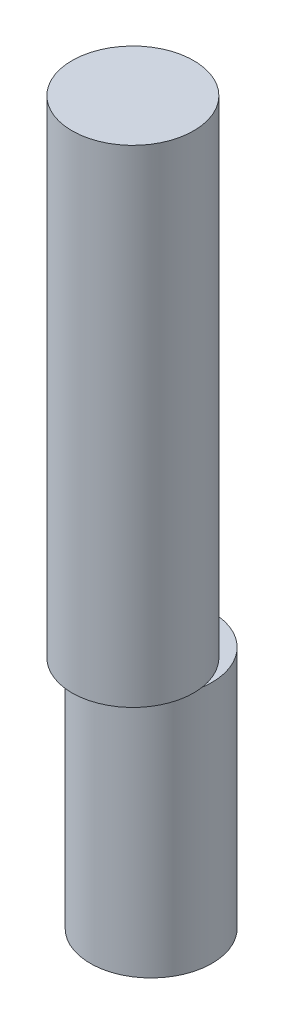
ISO-10303-21;
HEADER;
FILE_DESCRIPTION(('STEP AP214'),'2;1');
FILE_NAME('part.step','',(''),(''),'','','');
FILE_SCHEMA(('AUTOMOTIVE_DESIGN { 1 0 10303 214 1 1 1 1 }'));
ENDSEC;
DATA;
#1=APPLICATION_CONTEXT('core data for automotive mechanical design processes');
#2=APPLICATION_PROTOCOL_DEFINITION('international standard','automotive_design',2000,#1);
#3=PRODUCT_CONTEXT('',#1,'mechanical');
#4=PRODUCT('Part','Part','',(#3));
#5=PRODUCT_RELATED_PRODUCT_CATEGORY('part','',(#4));
#6=PRODUCT_DEFINITION_FORMATION('','',#4);
#7=PRODUCT_DEFINITION_CONTEXT('part definition',#1,'design');
#8=PRODUCT_DEFINITION('design','',#6,#7);
#9=PRODUCT_DEFINITION_SHAPE('','',#8);
#10=(LENGTH_UNIT() NAMED_UNIT(*) SI_UNIT(.MILLI.,.METRE.));
#11=(NAMED_UNIT(*) PLANE_ANGLE_UNIT() SI_UNIT($,.RADIAN.));
#12=(NAMED_UNIT(*) SI_UNIT($,.STERADIAN.) SOLID_ANGLE_UNIT());
#13=UNCERTAINTY_MEASURE_WITH_UNIT(LENGTH_MEASURE(1.E-05),#10,'distance_accuracy_value','');
#14=(GEOMETRIC_REPRESENTATION_CONTEXT(3) GLOBAL_UNCERTAINTY_ASSIGNED_CONTEXT((#13)) GLOBAL_UNIT_ASSIGNED_CONTEXT((#10,
#11,#12)) REPRESENTATION_CONTEXT('',''));
#15=CARTESIAN_POINT('',(0.,0.,0.));
#16=DIRECTION('',(0.,0.,1.));
#17=DIRECTION('',(1.,0.,0.));
#18=AXIS2_PLACEMENT_3D('',#15,#16,#17);
#19=CARTESIAN_POINT('',(0.,50.8,0.));
#20=DIRECTION('',(0.,-1.,0.));
#21=DIRECTION('',(0.,0.,-1.));
#22=AXIS2_PLACEMENT_3D('',#19,#20,#21);
#23=CYLINDRICAL_SURFACE('',#22,6.35);
#24=CARTESIAN_POINT('',(0.,50.8,0.));
#25=DIRECTION('',(0.,1.,0.));
#26=DIRECTION('',(0.,0.,1.));
#27=AXIS2_PLACEMENT_3D('',#24,#25,#26);
#28=CIRCLE('',#27,6.35);
#29=CARTESIAN_POINT('',(0.,50.8,6.35));
#30=VERTEX_POINT('',#29);
#31=EDGE_CURVE('E11',#30,#30,#28,.T.);
#32=ORIENTED_EDGE('',*,*,#31,.F.);
#33=EDGE_LOOP('',(#32));
#34=FACE_BOUND('',#33,.T.);
#35=CARTESIAN_POINT('',(0.,0.,0.));
#36=DIRECTION('',(0.,1.,0.));
#37=DIRECTION('',(0.,0.,1.));
#38=AXIS2_PLACEMENT_3D('',#35,#36,#37);
#39=CIRCLE('',#38,6.35);
#40=CARTESIAN_POINT('',(6.27815607881805,0.,-0.9525));
#41=VERTEX_POINT('',#40);
#42=CARTESIAN_POINT('',(-6.27815607881805,0.,-0.9525));
#43=VERTEX_POINT('',#42);
#44=EDGE_CURVE('E48',#41,#43,#39,.T.);
#45=ORIENTED_EDGE('',*,*,#44,.T.);
#46=EDGE_CURVE('E64',#43,#41,#39,.T.);
#47=ORIENTED_EDGE('',*,*,#46,.T.);
#48=EDGE_LOOP('',(#45,#47));
#49=FACE_BOUND('',#48,.T.);
#50=ADVANCED_FACE('F45',(#34,#49),#23,.T.);
#51=CARTESIAN_POINT('',(0.,50.8,0.));
#52=DIRECTION('',(0.,1.,0.));
#53=DIRECTION('',(0.,0.,1.));
#54=AXIS2_PLACEMENT_3D('',#51,#52,#53);
#55=PLANE('',#54);
#56=ORIENTED_EDGE('',*,*,#31,.T.);
#57=EDGE_LOOP('',(#56));
#58=FACE_BOUND('',#57,.T.);
#59=ADVANCED_FACE('F93',(#58),#55,.T.);
#60=CARTESIAN_POINT('',(0.,0.,0.));
#61=DIRECTION('',(0.,1.,0.));
#62=DIRECTION('',(0.,0.,1.));
#63=AXIS2_PLACEMENT_3D('',#60,#61,#62);
#64=PLANE('',#63);
#65=CARTESIAN_POINT('',(0.,0.,-1.905));
#66=DIRECTION('',(0.,-1.,0.));
#67=DIRECTION('',(0.,0.,-1.));
#68=AXIS2_PLACEMENT_3D('',#65,#66,#67);
#69=CIRCLE('',#68,6.35);
#70=EDGE_CURVE('E59',#41,#43,#69,.T.);
#71=ORIENTED_EDGE('',*,*,#70,.F.);
#72=ORIENTED_EDGE('',*,*,#46,.F.);
#73=EDGE_LOOP('',(#71,#72));
#74=FACE_BOUND('',#73,.T.);
#75=ADVANCED_FACE('F69',(#74),#64,.F.);
#76=CARTESIAN_POINT('',(0.,-25.4,-1.905));
#77=DIRECTION('',(0.,1.,0.));
#78=DIRECTION('',(0.,0.,1.));
#79=AXIS2_PLACEMENT_3D('',#76,#77,#78);
#80=CYLINDRICAL_SURFACE('',#79,6.35);
#81=CARTESIAN_POINT('',(0.,-25.4,-1.905));
#82=DIRECTION('',(0.,-1.,0.));
#83=DIRECTION('',(0.,0.,-1.));
#84=AXIS2_PLACEMENT_3D('',#81,#82,#83);
#85=CIRCLE('',#84,6.35);
#86=CARTESIAN_POINT('',(0.,-25.4,-8.255));
#87=VERTEX_POINT('',#86);
#88=EDGE_CURVE('E71',#87,#87,#85,.T.);
#89=ORIENTED_EDGE('',*,*,#88,.F.);
#90=EDGE_LOOP('',(#89));
#91=FACE_BOUND('',#90,.T.);
#92=ORIENTED_EDGE('',*,*,#70,.T.);
#93=EDGE_CURVE('E72',#43,#41,#69,.T.);
#94=ORIENTED_EDGE('',*,*,#93,.T.);
#95=EDGE_LOOP('',(#92,#94));
#96=FACE_BOUND('',#95,.T.);
#97=ADVANCED_FACE('F77',(#91,#96),#80,.T.);
#98=CARTESIAN_POINT('',(0.,-25.4,-1.905));
#99=DIRECTION('',(0.,-1.,0.));
#100=DIRECTION('',(0.,0.,-1.));
#101=AXIS2_PLACEMENT_3D('',#98,#99,#100);
#102=PLANE('',#101);
#103=ORIENTED_EDGE('',*,*,#88,.T.);
#104=EDGE_LOOP('',(#103));
#105=FACE_BOUND('',#104,.T.);
#106=ADVANCED_FACE('F84',(#105),#102,.T.);
#107=CARTESIAN_POINT('',(0.,0.,-1.905));
#108=DIRECTION('',(0.,-1.,0.));
#109=DIRECTION('',(0.,0.,-1.));
#110=AXIS2_PLACEMENT_3D('',#107,#108,#109);
#111=PLANE('',#110);
#112=ORIENTED_EDGE('',*,*,#44,.F.);
#113=ORIENTED_EDGE('',*,*,#93,.F.);
#114=EDGE_LOOP('',(#112,#113));
#115=FACE_BOUND('',#114,.T.);
#116=ADVANCED_FACE('F73',(#115),#111,.F.);
#117=CLOSED_SHELL('',(#50,#59,#75,#97,#106,#116));
#118=MANIFOLD_SOLID_BREP('B2',#117);
#119=ADVANCED_BREP_SHAPE_REPRESENTATION('',(#18,#118),#14);
#120=SHAPE_DEFINITION_REPRESENTATION(#9,#119);
ENDSEC;
END-ISO-10303-21;
